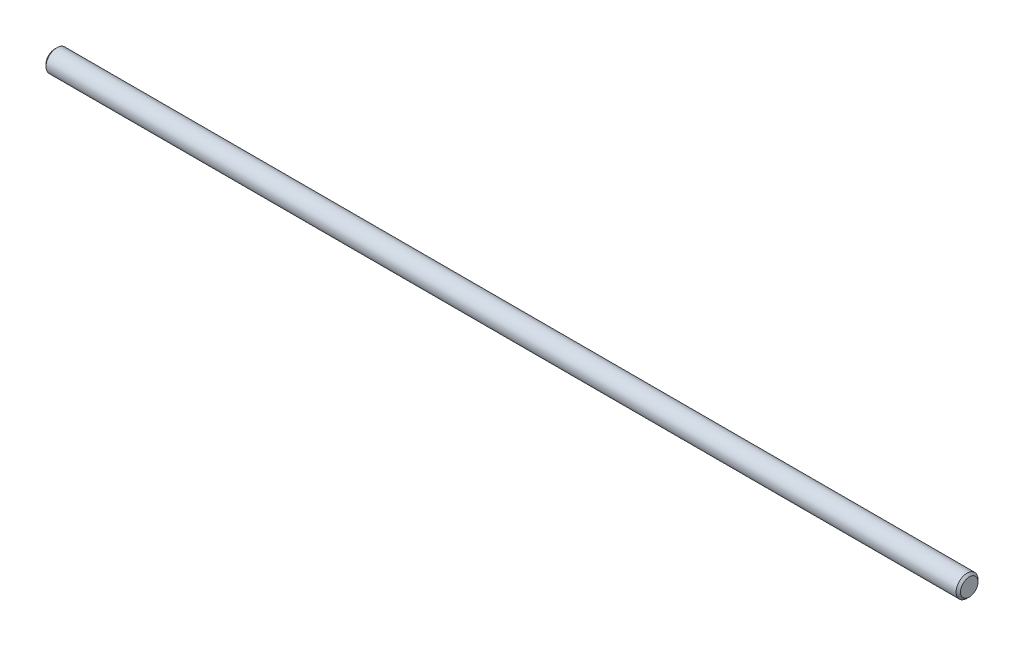
ISO-10303-21;
HEADER;
FILE_DESCRIPTION(('STEP AP214'),'2;1');
FILE_NAME('part.step','',(''),(''),'','','');
FILE_SCHEMA(('AUTOMOTIVE_DESIGN { 1 0 10303 214 1 1 1 1 }'));
ENDSEC;
DATA;
#1=APPLICATION_CONTEXT('core data for automotive mechanical design processes');
#2=APPLICATION_PROTOCOL_DEFINITION('international standard','automotive_design',2000,#1);
#3=PRODUCT_CONTEXT('',#1,'mechanical');
#4=PRODUCT('Part','Part','',(#3));
#5=PRODUCT_RELATED_PRODUCT_CATEGORY('part','',(#4));
#6=PRODUCT_DEFINITION_FORMATION('','',#4);
#7=PRODUCT_DEFINITION_CONTEXT('part definition',#1,'design');
#8=PRODUCT_DEFINITION('design','',#6,#7);
#9=PRODUCT_DEFINITION_SHAPE('','',#8);
#10=(LENGTH_UNIT() NAMED_UNIT(*) SI_UNIT(.MILLI.,.METRE.));
#11=(NAMED_UNIT(*) PLANE_ANGLE_UNIT() SI_UNIT($,.RADIAN.));
#12=(NAMED_UNIT(*) SI_UNIT($,.STERADIAN.) SOLID_ANGLE_UNIT());
#13=UNCERTAINTY_MEASURE_WITH_UNIT(LENGTH_MEASURE(1.E-05),#10,'distance_accuracy_value','');
#14=(GEOMETRIC_REPRESENTATION_CONTEXT(3) GLOBAL_UNCERTAINTY_ASSIGNED_CONTEXT((#13)) GLOBAL_UNIT_ASSIGNED_CONTEXT((#10,
#11,#12)) REPRESENTATION_CONTEXT('',''));
#15=CARTESIAN_POINT('',(0.,0.,0.));
#16=DIRECTION('',(0.,0.,1.));
#17=DIRECTION('',(1.,0.,0.));
#18=AXIS2_PLACEMENT_3D('',#15,#16,#17);
#19=CARTESIAN_POINT('',(209.,0.,0.));
#20=DIRECTION('',(-1.,0.,0.));
#21=DIRECTION('',(0.,0.,-1.));
#22=AXIS2_PLACEMENT_3D('',#19,#20,#21);
#23=CYLINDRICAL_SURFACE('',#22,5.);
#24=CARTESIAN_POINT('',(208.,0.,0.));
#25=DIRECTION('',(-1.,0.,0.));
#26=DIRECTION('',(0.,0.,1.));
#27=AXIS2_PLACEMENT_3D('',#24,#25,#26);
#28=CIRCLE('',#27,5.);
#29=CARTESIAN_POINT('',(208.,0.,5.));
#30=VERTEX_POINT('',#29);
#31=EDGE_CURVE('E40',#30,#30,#28,.F.);
#32=ORIENTED_EDGE('',*,*,#31,.F.);
#33=EDGE_LOOP('',(#32));
#34=FACE_BOUND('',#33,.T.);
#35=CARTESIAN_POINT('',(-208.,0.,0.));
#36=DIRECTION('',(-1.,0.,0.));
#37=DIRECTION('',(0.,0.,1.));
#38=AXIS2_PLACEMENT_3D('',#35,#36,#37);
#39=CIRCLE('',#38,5.);
#40=CARTESIAN_POINT('',(-208.,0.,5.));
#41=VERTEX_POINT('',#40);
#42=EDGE_CURVE('E44',#41,#41,#39,.T.);
#43=ORIENTED_EDGE('',*,*,#42,.F.);
#44=EDGE_LOOP('',(#43));
#45=FACE_BOUND('',#44,.T.);
#46=ADVANCED_FACE('F33',(#34,#45),#23,.T.);
#47=CARTESIAN_POINT('',(209.,0.,0.));
#48=DIRECTION('',(1.,0.,0.));
#49=DIRECTION('',(0.,0.,1.));
#50=AXIS2_PLACEMENT_3D('',#47,#48,#49);
#51=PLANE('',#50);
#52=CARTESIAN_POINT('',(209.,0.,0.));
#53=DIRECTION('',(-1.,0.,0.));
#54=DIRECTION('',(0.,0.,1.));
#55=AXIS2_PLACEMENT_3D('',#52,#53,#54);
#56=CIRCLE('',#55,4.00000000000006);
#57=CARTESIAN_POINT('',(209.,0.,4.00000000000006));
#58=VERTEX_POINT('',#57);
#59=EDGE_CURVE('E48',#58,#58,#56,.T.);
#60=ORIENTED_EDGE('',*,*,#59,.F.);
#61=EDGE_LOOP('',(#60));
#62=FACE_BOUND('',#61,.T.);
#63=ADVANCED_FACE('F56',(#62),#51,.T.);
#64=CARTESIAN_POINT('',(-209.,0.,0.));
#65=DIRECTION('',(1.,0.,0.));
#66=DIRECTION('',(0.,0.,1.));
#67=AXIS2_PLACEMENT_3D('',#64,#65,#66);
#68=PLANE('',#67);
#69=CARTESIAN_POINT('',(-209.,0.,0.));
#70=DIRECTION('',(-1.,0.,0.));
#71=DIRECTION('',(0.,0.,1.));
#72=AXIS2_PLACEMENT_3D('',#69,#70,#71);
#73=CIRCLE('',#72,4.00000000000006);
#74=CARTESIAN_POINT('',(-209.,0.,4.00000000000006));
#75=VERTEX_POINT('',#74);
#76=EDGE_CURVE('E10',#75,#75,#73,.F.);
#77=ORIENTED_EDGE('',*,*,#76,.F.);
#78=EDGE_LOOP('',(#77));
#79=FACE_BOUND('',#78,.T.);
#80=ADVANCED_FACE('F58',(#79),#68,.F.);
#81=CARTESIAN_POINT('',(209.,0.,0.));
#82=DIRECTION('',(-1.,0.,0.));
#83=DIRECTION('',(0.,0.,-1.));
#84=AXIS2_PLACEMENT_3D('',#81,#82,#83);
#85=CONICAL_SURFACE('',#84,4.00000000000006,0.785398163397473);
#86=ORIENTED_EDGE('',*,*,#31,.T.);
#87=EDGE_LOOP('',(#86));
#88=FACE_BOUND('',#87,.T.);
#89=ORIENTED_EDGE('',*,*,#59,.T.);
#90=EDGE_LOOP('',(#89));
#91=FACE_BOUND('',#90,.T.);
#92=ADVANCED_FACE('F54',(#88,#91),#85,.T.);
#93=CARTESIAN_POINT('',(-208.,0.,0.));
#94=DIRECTION('',(1.,0.,0.));
#95=DIRECTION('',(0.,0.,1.));
#96=AXIS2_PLACEMENT_3D('',#93,#94,#95);
#97=CONICAL_SURFACE('',#96,5.,0.785398163397446);
#98=ORIENTED_EDGE('',*,*,#76,.T.);
#99=EDGE_LOOP('',(#98));
#100=FACE_BOUND('',#99,.T.);
#101=ORIENTED_EDGE('',*,*,#42,.T.);
#102=EDGE_LOOP('',(#101));
#103=FACE_BOUND('',#102,.T.);
#104=ADVANCED_FACE('F35',(#100,#103),#97,.T.);
#105=CLOSED_SHELL('',(#46,#63,#80,#92,#104));
#106=MANIFOLD_SOLID_BREP('B2',#105);
#107=ADVANCED_BREP_SHAPE_REPRESENTATION('',(#18,#106),#14);
#108=SHAPE_DEFINITION_REPRESENTATION(#9,#107);
ENDSEC;
END-ISO-10303-21;
